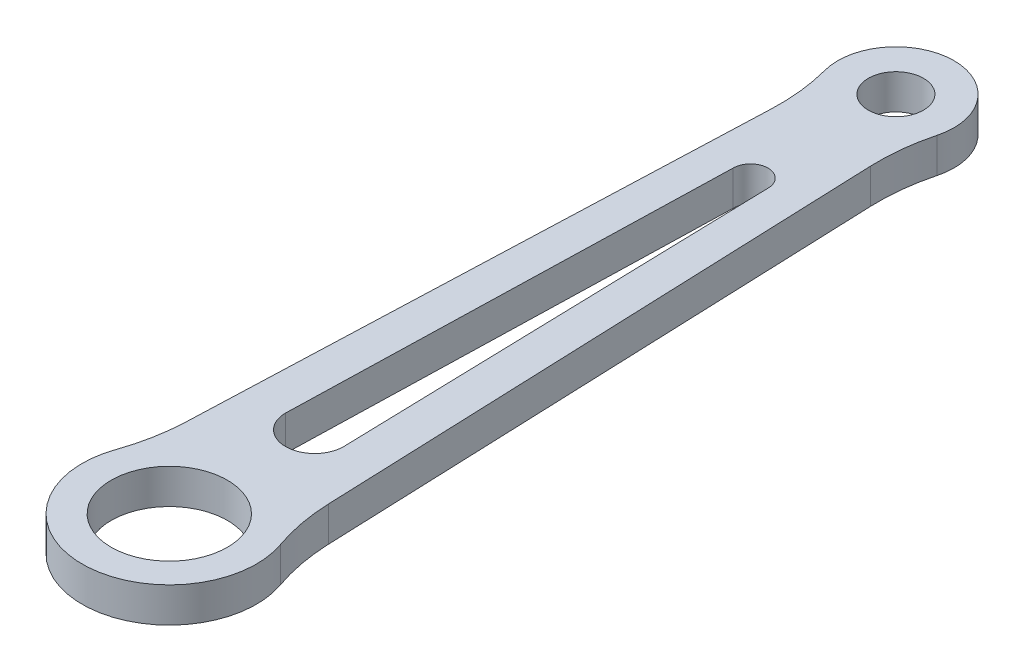
ISO-10303-21;
HEADER;
FILE_DESCRIPTION(('STEP AP214'),'2;1');
FILE_NAME('part.step','',(''),(''),'','','');
FILE_SCHEMA(('AUTOMOTIVE_DESIGN { 1 0 10303 214 1 1 1 1 }'));
ENDSEC;
DATA;
#1=APPLICATION_CONTEXT('core data for automotive mechanical design processes');
#2=APPLICATION_PROTOCOL_DEFINITION('international standard','automotive_design',2000,#1);
#3=PRODUCT_CONTEXT('',#1,'mechanical');
#4=PRODUCT('Part','Part','',(#3));
#5=PRODUCT_RELATED_PRODUCT_CATEGORY('part','',(#4));
#6=PRODUCT_DEFINITION_FORMATION('','',#4);
#7=PRODUCT_DEFINITION_CONTEXT('part definition',#1,'design');
#8=PRODUCT_DEFINITION('design','',#6,#7);
#9=PRODUCT_DEFINITION_SHAPE('','',#8);
#10=(LENGTH_UNIT() NAMED_UNIT(*) SI_UNIT(.MILLI.,.METRE.));
#11=(NAMED_UNIT(*) PLANE_ANGLE_UNIT() SI_UNIT($,.RADIAN.));
#12=(NAMED_UNIT(*) SI_UNIT($,.STERADIAN.) SOLID_ANGLE_UNIT());
#13=UNCERTAINTY_MEASURE_WITH_UNIT(LENGTH_MEASURE(1.E-05),#10,'distance_accuracy_value','');
#14=(GEOMETRIC_REPRESENTATION_CONTEXT(3) GLOBAL_UNCERTAINTY_ASSIGNED_CONTEXT((#13)) GLOBAL_UNIT_ASSIGNED_CONTEXT((#10,
#11,#12)) REPRESENTATION_CONTEXT('',''));
#15=CARTESIAN_POINT('',(0.,0.,0.));
#16=DIRECTION('',(0.,0.,1.));
#17=DIRECTION('',(1.,0.,0.));
#18=AXIS2_PLACEMENT_3D('',#15,#16,#17);
#19=CARTESIAN_POINT('',(0.,12.,0.));
#20=DIRECTION('',(0.,1.,0.));
#21=DIRECTION('',(0.,0.,1.));
#22=AXIS2_PLACEMENT_3D('',#19,#20,#21);
#23=PLANE('',#22);
#24=DIRECTION('',(0.0382406015651433,0.,-0.999268560694239));
#25=VECTOR('',#24,1.);
#26=CARTESIAN_POINT('',(-25.597124885427,12.,-0.979565946993043));
#27=LINE('',#26,#25);
#28=CARTESIAN_POINT('',(-24.4772515869623,12.,-30.2430747129415));
#29=VERTEX_POINT('',#28);
#30=CARTESIAN_POINT('',(-17.0516738536364,12.,-224.281506908195));
#31=VERTEX_POINT('',#30);
#32=EDGE_CURVE('E92',#29,#31,#27,.T.);
#33=ORIENTED_EDGE('',*,*,#32,.F.);
#34=CARTESIAN_POINT('',(-94.4260508355591,12.,-32.9199168225015));
#35=DIRECTION('',(0.,1.,0.));
#36=DIRECTION('',(0.,0.,1.));
#37=AXIS2_PLACEMENT_3D('',#34,#35,#36);
#38=CIRCLE('',#37,70.);
#39=CARTESIAN_POINT('',(-28.3278152506677,12.,-9.87597504675045));
#40=VERTEX_POINT('',#39);
#41=EDGE_CURVE('E198',#40,#29,#38,.T.);
#42=ORIENTED_EDGE('',*,*,#41,.F.);
#43=CARTESIAN_POINT('',(0.,12.,0.));
#44=DIRECTION('',(0.,1.,0.));
#45=DIRECTION('',(0.,0.,1.));
#46=AXIS2_PLACEMENT_3D('',#43,#44,#45);
#47=CIRCLE('',#46,30.);
#48=CARTESIAN_POINT('',(28.3278152506677,12.,-9.87597504675047));
#49=VERTEX_POINT('',#48);
#50=EDGE_CURVE('E212',#40,#49,#47,.T.);
#51=ORIENTED_EDGE('',*,*,#50,.T.);
#52=CARTESIAN_POINT('',(94.4260508355591,12.,-32.9199168225015));
#53=DIRECTION('',(0.,1.,0.));
#54=DIRECTION('',(0.,0.,1.));
#55=AXIS2_PLACEMENT_3D('',#52,#53,#54);
#56=CIRCLE('',#55,70.);
#57=CARTESIAN_POINT('',(24.4772515869623,12.,-30.2430747129415));
#58=VERTEX_POINT('',#57);
#59=EDGE_CURVE('E215',#49,#58,#56,.F.);
#60=ORIENTED_EDGE('',*,*,#59,.T.);
#61=DIRECTION('',(-0.0382406015651433,0.,-0.999268560694239));
#62=VECTOR('',#61,1.);
#63=CARTESIAN_POINT('',(25.597124885427,12.,-0.979565946993043));
#64=LINE('',#63,#62);
#65=CARTESIAN_POINT('',(17.0516738536364,12.,-224.281506908195));
#66=VERTEX_POINT('',#65);
#67=EDGE_CURVE('E218',#58,#66,#64,.T.);
#68=ORIENTED_EDGE('',*,*,#67,.T.);
#69=CARTESIAN_POINT('',(87.0004731022332,12.,-226.958349017755));
#70=DIRECTION('',(0.,1.,0.));
#71=DIRECTION('',(0.,0.,1.));
#72=AXIS2_PLACEMENT_3D('',#69,#70,#71);
#73=CIRCLE('',#72,70.);
#74=CARTESIAN_POINT('',(19.3334384671629,12.,-244.879633115057));
#75=VERTEX_POINT('',#74);
#76=EDGE_CURVE('E221',#66,#75,#73,.F.);
#77=ORIENTED_EDGE('',*,*,#76,.T.);
#78=CARTESIAN_POINT('',(0.,12.,-250.));
#79=DIRECTION('',(0.,1.,0.));
#80=DIRECTION('',(0.,0.,1.));
#81=AXIS2_PLACEMENT_3D('',#78,#79,#80);
#82=CIRCLE('',#81,20.);
#83=CARTESIAN_POINT('',(-19.3334384671629,12.,-244.879633115057));
#84=VERTEX_POINT('',#83);
#85=EDGE_CURVE('E224',#75,#84,#82,.T.);
#86=ORIENTED_EDGE('',*,*,#85,.T.);
#87=CARTESIAN_POINT('',(-87.0004731022332,12.,-226.958349017755));
#88=DIRECTION('',(0.,1.,0.));
#89=DIRECTION('',(0.,0.,1.));
#90=AXIS2_PLACEMENT_3D('',#87,#88,#89);
#91=CIRCLE('',#90,70.);
#92=EDGE_CURVE('E227',#31,#84,#91,.T.);
#93=ORIENTED_EDGE('',*,*,#92,.F.);
#94=EDGE_LOOP('',(#33,#42,#51,#60,#68,#77,#86,#93));
#95=FACE_BOUND('',#94,.T.);
#96=CARTESIAN_POINT('',(0.,12.,-50.));
#97=DIRECTION('',(0.,1.,0.));
#98=DIRECTION('',(0.,0.,1.));
#99=AXIS2_PLACEMENT_3D('',#96,#97,#98);
#100=CIRCLE('',#99,9.99999999999994);
#101=CARTESIAN_POINT('',(-9.99999999999994,12.,-50.));
#102=VERTEX_POINT('',#101);
#103=CARTESIAN_POINT('',(9.99999999999994,12.,-50.));
#104=VERTEX_POINT('',#103);
#105=EDGE_CURVE('E100',#102,#104,#100,.T.);
#106=ORIENTED_EDGE('',*,*,#105,.F.);
#107=DIRECTION('',(-0.0266571902389802,0.,0.999644633961771));
#108=VECTOR('',#107,1.);
#109=CARTESIAN_POINT('',(-11.3252798010303,12.,-0.302007461360805));
#110=LINE('',#109,#108);
#111=CARTESIAN_POINT('',(-5.99999999999999,12.,-200.));
#112=VERTEX_POINT('',#111);
#113=EDGE_CURVE('E176',#112,#102,#110,.T.);
#114=ORIENTED_EDGE('',*,*,#113,.F.);
#115=CARTESIAN_POINT('',(0.,12.,-200.));
#116=DIRECTION('',(0.,1.,0.));
#117=DIRECTION('',(0.,0.,1.));
#118=AXIS2_PLACEMENT_3D('',#115,#116,#117);
#119=CIRCLE('',#118,5.99999999999999);
#120=CARTESIAN_POINT('',(5.99999999999999,12.,-200.));
#121=VERTEX_POINT('',#120);
#122=EDGE_CURVE('E182',#121,#112,#119,.T.);
#123=ORIENTED_EDGE('',*,*,#122,.F.);
#124=DIRECTION('',(0.0266571902389802,0.,0.999644633961771));
#125=VECTOR('',#124,1.);
#126=CARTESIAN_POINT('',(11.3252798010303,12.,-0.302007461360805));
#127=LINE('',#126,#125);
#128=EDGE_CURVE('E188',#121,#104,#127,.T.);
#129=ORIENTED_EDGE('',*,*,#128,.T.);
#130=EDGE_LOOP('',(#106,#114,#123,#129));
#131=FACE_BOUND('',#130,.T.);
#132=CARTESIAN_POINT('',(0.,12.,0.));
#133=DIRECTION('',(0.,1.,0.));
#134=DIRECTION('',(0.,0.,1.));
#135=AXIS2_PLACEMENT_3D('',#132,#133,#134);
#136=CIRCLE('',#135,19.9999971966483);
#137=CARTESIAN_POINT('',(0.,12.,19.9999971966483));
#138=VERTEX_POINT('',#137);
#139=EDGE_CURVE('E231',#138,#138,#136,.T.);
#140=ORIENTED_EDGE('',*,*,#139,.F.);
#141=EDGE_LOOP('',(#140));
#142=FACE_BOUND('',#141,.T.);
#143=CARTESIAN_POINT('',(0.,12.,-250.));
#144=DIRECTION('',(0.,1.,0.));
#145=DIRECTION('',(0.,0.,1.));
#146=AXIS2_PLACEMENT_3D('',#143,#144,#145);
#147=CIRCLE('',#146,9.5);
#148=CARTESIAN_POINT('',(0.,12.,-240.5));
#149=VERTEX_POINT('',#148);
#150=EDGE_CURVE('E235',#149,#149,#147,.T.);
#151=ORIENTED_EDGE('',*,*,#150,.F.);
#152=EDGE_LOOP('',(#151));
#153=FACE_BOUND('',#152,.T.);
#154=ADVANCED_FACE('F77',(#95,#131,#142,#153),#23,.T.);
#155=CARTESIAN_POINT('',(0.,0.,0.));
#156=DIRECTION('',(0.,1.,0.));
#157=DIRECTION('',(0.,0.,1.));
#158=AXIS2_PLACEMENT_3D('',#155,#156,#157);
#159=PLANE('',#158);
#160=CARTESIAN_POINT('',(-94.4260508355591,0.,-32.9199168225015));
#161=DIRECTION('',(0.,1.,0.));
#162=DIRECTION('',(0.,0.,1.));
#163=AXIS2_PLACEMENT_3D('',#160,#161,#162);
#164=CIRCLE('',#163,70.);
#165=CARTESIAN_POINT('',(-28.3278152506677,0.,-9.87597504675045));
#166=VERTEX_POINT('',#165);
#167=CARTESIAN_POINT('',(-24.4772515869623,0.,-30.2430747129415));
#168=VERTEX_POINT('',#167);
#169=EDGE_CURVE('E85',#166,#168,#164,.T.);
#170=ORIENTED_EDGE('',*,*,#169,.T.);
#171=DIRECTION('',(0.0382406015651433,0.,-0.999268560694239));
#172=VECTOR('',#171,1.);
#173=CARTESIAN_POINT('',(-25.597124885427,0.,-0.979565946993044));
#174=LINE('',#173,#172);
#175=CARTESIAN_POINT('',(-17.0516738536364,0.,-224.281506908195));
#176=VERTEX_POINT('',#175);
#177=EDGE_CURVE('E12',#168,#176,#174,.T.);
#178=ORIENTED_EDGE('',*,*,#177,.T.);
#179=CARTESIAN_POINT('',(-87.0004731022332,0.,-226.958349017755));
#180=DIRECTION('',(0.,1.,0.));
#181=DIRECTION('',(0.,0.,1.));
#182=AXIS2_PLACEMENT_3D('',#179,#180,#181);
#183=CIRCLE('',#182,70.);
#184=CARTESIAN_POINT('',(-19.3334384671629,0.,-244.879633115057));
#185=VERTEX_POINT('',#184);
#186=EDGE_CURVE('E251',#176,#185,#183,.T.);
#187=ORIENTED_EDGE('',*,*,#186,.T.);
#188=CARTESIAN_POINT('',(0.,0.,-250.));
#189=DIRECTION('',(0.,1.,0.));
#190=DIRECTION('',(0.,0.,1.));
#191=AXIS2_PLACEMENT_3D('',#188,#189,#190);
#192=CIRCLE('',#191,20.);
#193=CARTESIAN_POINT('',(19.3334384671629,0.,-244.879633115057));
#194=VERTEX_POINT('',#193);
#195=EDGE_CURVE('E254',#194,#185,#192,.T.);
#196=ORIENTED_EDGE('',*,*,#195,.F.);
#197=CARTESIAN_POINT('',(87.0004731022332,0.,-226.958349017755));
#198=DIRECTION('',(0.,1.,0.));
#199=DIRECTION('',(0.,0.,1.));
#200=AXIS2_PLACEMENT_3D('',#197,#198,#199);
#201=CIRCLE('',#200,70.);
#202=CARTESIAN_POINT('',(17.0516738536364,0.,-224.281506908195));
#203=VERTEX_POINT('',#202);
#204=EDGE_CURVE('E257',#203,#194,#201,.F.);
#205=ORIENTED_EDGE('',*,*,#204,.F.);
#206=DIRECTION('',(-0.0382406015651433,0.,-0.999268560694239));
#207=VECTOR('',#206,1.);
#208=CARTESIAN_POINT('',(25.597124885427,0.,-0.979565946993044));
#209=LINE('',#208,#207);
#210=CARTESIAN_POINT('',(24.4772515869623,0.,-30.2430747129415));
#211=VERTEX_POINT('',#210);
#212=EDGE_CURVE('E259',#211,#203,#209,.T.);
#213=ORIENTED_EDGE('',*,*,#212,.F.);
#214=CARTESIAN_POINT('',(94.4260508355591,0.,-32.9199168225015));
#215=DIRECTION('',(0.,1.,0.));
#216=DIRECTION('',(0.,0.,1.));
#217=AXIS2_PLACEMENT_3D('',#214,#215,#216);
#218=CIRCLE('',#217,70.);
#219=CARTESIAN_POINT('',(28.3278152506677,0.,-9.87597504675047));
#220=VERTEX_POINT('',#219);
#221=EDGE_CURVE('E261',#220,#211,#218,.F.);
#222=ORIENTED_EDGE('',*,*,#221,.F.);
#223=CARTESIAN_POINT('',(0.,0.,0.));
#224=DIRECTION('',(0.,1.,0.));
#225=DIRECTION('',(0.,0.,1.));
#226=AXIS2_PLACEMENT_3D('',#223,#224,#225);
#227=CIRCLE('',#226,30.);
#228=EDGE_CURVE('E263',#166,#220,#227,.T.);
#229=ORIENTED_EDGE('',*,*,#228,.F.);
#230=EDGE_LOOP('',(#170,#178,#187,#196,#205,#213,#222,#229));
#231=FACE_BOUND('',#230,.T.);
#232=DIRECTION('',(-0.0266571902389802,0.,0.999644633961771));
#233=VECTOR('',#232,1.);
#234=CARTESIAN_POINT('',(-11.3252798010303,0.,-0.302007461360805));
#235=LINE('',#234,#233);
#236=CARTESIAN_POINT('',(-5.99999999999999,0.,-200.));
#237=VERTEX_POINT('',#236);
#238=CARTESIAN_POINT('',(-9.99999999999994,0.,-50.));
#239=VERTEX_POINT('',#238);
#240=EDGE_CURVE('E248',#237,#239,#235,.T.);
#241=ORIENTED_EDGE('',*,*,#240,.T.);
#242=CARTESIAN_POINT('',(0.,0.,-50.));
#243=DIRECTION('',(0.,1.,0.));
#244=DIRECTION('',(0.,0.,1.));
#245=AXIS2_PLACEMENT_3D('',#242,#243,#244);
#246=CIRCLE('',#245,9.99999999999994);
#247=CARTESIAN_POINT('',(9.99999999999994,0.,-50.));
#248=VERTEX_POINT('',#247);
#249=EDGE_CURVE('E170',#239,#248,#246,.T.);
#250=ORIENTED_EDGE('',*,*,#249,.T.);
#251=DIRECTION('',(0.0266571902389802,0.,0.999644633961771));
#252=VECTOR('',#251,1.);
#253=CARTESIAN_POINT('',(11.3252798010303,0.,-0.302007461360805));
#254=LINE('',#253,#252);
#255=CARTESIAN_POINT('',(5.99999999999999,0.,-200.));
#256=VERTEX_POINT('',#255);
#257=EDGE_CURVE('E238',#256,#248,#254,.T.);
#258=ORIENTED_EDGE('',*,*,#257,.F.);
#259=CARTESIAN_POINT('',(0.,0.,-200.));
#260=DIRECTION('',(0.,1.,0.));
#261=DIRECTION('',(0.,0.,1.));
#262=AXIS2_PLACEMENT_3D('',#259,#260,#261);
#263=CIRCLE('',#262,5.99999999999999);
#264=EDGE_CURVE('E245',#256,#237,#263,.T.);
#265=ORIENTED_EDGE('',*,*,#264,.T.);
#266=EDGE_LOOP('',(#241,#250,#258,#265));
#267=FACE_BOUND('',#266,.T.);
#268=CARTESIAN_POINT('',(0.,0.,0.));
#269=DIRECTION('',(0.,1.,0.));
#270=DIRECTION('',(0.,0.,1.));
#271=AXIS2_PLACEMENT_3D('',#268,#269,#270);
#272=CIRCLE('',#271,19.9999971966483);
#273=CARTESIAN_POINT('',(0.,0.,19.9999971966483));
#274=VERTEX_POINT('',#273);
#275=EDGE_CURVE('E234',#274,#274,#272,.T.);
#276=ORIENTED_EDGE('',*,*,#275,.T.);
#277=EDGE_LOOP('',(#276));
#278=FACE_BOUND('',#277,.T.);
#279=CARTESIAN_POINT('',(0.,0.,-250.));
#280=DIRECTION('',(0.,1.,0.));
#281=DIRECTION('',(0.,0.,1.));
#282=AXIS2_PLACEMENT_3D('',#279,#280,#281);
#283=CIRCLE('',#282,9.5);
#284=CARTESIAN_POINT('',(0.,0.,-240.5));
#285=VERTEX_POINT('',#284);
#286=EDGE_CURVE('E239',#285,#285,#283,.T.);
#287=ORIENTED_EDGE('',*,*,#286,.T.);
#288=EDGE_LOOP('',(#287));
#289=FACE_BOUND('',#288,.T.);
#290=ADVANCED_FACE('F79',(#231,#267,#278,#289),#159,.F.);
#291=CARTESIAN_POINT('',(0.,12.,-250.));
#292=DIRECTION('',(0.,-1.,0.));
#293=DIRECTION('',(0.,0.,-1.));
#294=AXIS2_PLACEMENT_3D('',#291,#292,#293);
#295=CYLINDRICAL_SURFACE('',#294,9.5);
#296=ORIENTED_EDGE('',*,*,#150,.T.);
#297=EDGE_LOOP('',(#296));
#298=FACE_BOUND('',#297,.T.);
#299=ORIENTED_EDGE('',*,*,#286,.F.);
#300=EDGE_LOOP('',(#299));
#301=FACE_BOUND('',#300,.T.);
#302=ADVANCED_FACE('F302',(#298,#301),#295,.F.);
#303=CARTESIAN_POINT('',(0.,-13.,0.));
#304=DIRECTION('',(0.,1.,0.));
#305=DIRECTION('',(0.,0.,1.));
#306=AXIS2_PLACEMENT_3D('',#303,#304,#305);
#307=CYLINDRICAL_SURFACE('',#306,19.9999971966483);
#308=ORIENTED_EDGE('',*,*,#139,.T.);
#309=EDGE_LOOP('',(#308));
#310=FACE_BOUND('',#309,.T.);
#311=ORIENTED_EDGE('',*,*,#275,.F.);
#312=EDGE_LOOP('',(#311));
#313=FACE_BOUND('',#312,.T.);
#314=ADVANCED_FACE('F306',(#310,#313),#307,.F.);
#315=CARTESIAN_POINT('',(0.,-13.,-50.));
#316=DIRECTION('',(0.,1.,0.));
#317=DIRECTION('',(0.,0.,1.));
#318=AXIS2_PLACEMENT_3D('',#315,#316,#317);
#319=CYLINDRICAL_SURFACE('',#318,9.99999999999994);
#320=DIRECTION('',(0.,1.,0.));
#321=VECTOR('',#320,1.);
#322=CARTESIAN_POINT('',(-9.99999999999994,-13.,-50.));
#323=LINE('',#322,#321);
#324=EDGE_CURVE('E166',#239,#102,#323,.T.);
#325=ORIENTED_EDGE('',*,*,#324,.T.);
#326=ORIENTED_EDGE('',*,*,#105,.T.);
#327=DIRECTION('',(0.,1.,0.));
#328=VECTOR('',#327,1.);
#329=CARTESIAN_POINT('',(9.99999999999994,-13.,-50.));
#330=LINE('',#329,#328);
#331=EDGE_CURVE('E183',#248,#104,#330,.T.);
#332=ORIENTED_EDGE('',*,*,#331,.F.);
#333=ORIENTED_EDGE('',*,*,#249,.F.);
#334=EDGE_LOOP('',(#325,#326,#332,#333));
#335=FACE_BOUND('',#334,.T.);
#336=ADVANCED_FACE('F168',(#335),#319,.F.);
#337=CARTESIAN_POINT('',(-11.3252798010303,-13.,-0.302007461360805));
#338=DIRECTION('',(-0.999644633961771,0.,-0.0266571902389802));
#339=DIRECTION('',(-0.0266571902389802,0.,0.999644633961771));
#340=AXIS2_PLACEMENT_3D('',#337,#338,#339);
#341=PLANE('',#340);
#342=DIRECTION('',(0.,1.,0.));
#343=VECTOR('',#342,1.);
#344=CARTESIAN_POINT('',(-5.99999999999999,-13.,-200.));
#345=LINE('',#344,#343);
#346=EDGE_CURVE('E173',#237,#112,#345,.T.);
#347=ORIENTED_EDGE('',*,*,#346,.T.);
#348=ORIENTED_EDGE('',*,*,#113,.T.);
#349=ORIENTED_EDGE('',*,*,#324,.F.);
#350=ORIENTED_EDGE('',*,*,#240,.F.);
#351=EDGE_LOOP('',(#347,#348,#349,#350));
#352=FACE_BOUND('',#351,.T.);
#353=ADVANCED_FACE('F177',(#352),#341,.F.);
#354=CARTESIAN_POINT('',(0.,-13.,-200.));
#355=DIRECTION('',(0.,1.,0.));
#356=DIRECTION('',(0.,0.,1.));
#357=AXIS2_PLACEMENT_3D('',#354,#355,#356);
#358=CYLINDRICAL_SURFACE('',#357,5.99999999999999);
#359=DIRECTION('',(0.,1.,0.));
#360=VECTOR('',#359,1.);
#361=CARTESIAN_POINT('',(5.99999999999999,-13.,-200.));
#362=LINE('',#361,#360);
#363=EDGE_CURVE('E436',#256,#121,#362,.T.);
#364=ORIENTED_EDGE('',*,*,#363,.T.);
#365=ORIENTED_EDGE('',*,*,#122,.T.);
#366=ORIENTED_EDGE('',*,*,#346,.F.);
#367=ORIENTED_EDGE('',*,*,#264,.F.);
#368=EDGE_LOOP('',(#364,#365,#366,#367));
#369=FACE_BOUND('',#368,.T.);
#370=ADVANCED_FACE('F293',(#369),#358,.F.);
#371=CARTESIAN_POINT('',(11.3252798010303,-13.,-0.302007461360805));
#372=DIRECTION('',(-0.999644633961771,0.,0.0266571902389802));
#373=DIRECTION('',(0.0266571902389802,0.,0.999644633961771));
#374=AXIS2_PLACEMENT_3D('',#371,#372,#373);
#375=PLANE('',#374);
#376=ORIENTED_EDGE('',*,*,#257,.T.);
#377=ORIENTED_EDGE('',*,*,#331,.T.);
#378=ORIENTED_EDGE('',*,*,#128,.F.);
#379=ORIENTED_EDGE('',*,*,#363,.F.);
#380=EDGE_LOOP('',(#376,#377,#378,#379));
#381=FACE_BOUND('',#380,.T.);
#382=ADVANCED_FACE('F286',(#381),#375,.T.);
#383=CARTESIAN_POINT('',(-25.597124885427,-13.,-0.979565946993043));
#384=DIRECTION('',(0.999268560694239,0.,0.0382406015651433));
#385=DIRECTION('',(0.0382406015651433,0.,-0.999268560694239));
#386=AXIS2_PLACEMENT_3D('',#383,#384,#385);
#387=PLANE('',#386);
#388=DIRECTION('',(0.,1.,0.));
#389=VECTOR('',#388,1.);
#390=CARTESIAN_POINT('',(-24.4772515869623,-13.,-30.2430747129415));
#391=LINE('',#390,#389);
#392=EDGE_CURVE('E189',#168,#29,#391,.T.);
#393=ORIENTED_EDGE('',*,*,#392,.T.);
#394=ORIENTED_EDGE('',*,*,#32,.T.);
#395=DIRECTION('',(0.,1.,0.));
#396=VECTOR('',#395,1.);
#397=CARTESIAN_POINT('',(-17.0516738536364,-13.,-224.281506908195));
#398=LINE('',#397,#396);
#399=EDGE_CURVE('E196',#176,#31,#398,.T.);
#400=ORIENTED_EDGE('',*,*,#399,.F.);
#401=ORIENTED_EDGE('',*,*,#177,.F.);
#402=EDGE_LOOP('',(#393,#394,#400,#401));
#403=FACE_BOUND('',#402,.T.);
#404=ADVANCED_FACE('F284',(#403),#387,.F.);
#405=CARTESIAN_POINT('',(-94.4260508355591,-13.,-32.9199168225015));
#406=DIRECTION('',(0.,1.,0.));
#407=DIRECTION('',(0.,0.,1.));
#408=AXIS2_PLACEMENT_3D('',#405,#406,#407);
#409=CYLINDRICAL_SURFACE('',#408,70.);
#410=DIRECTION('',(0.,1.,0.));
#411=VECTOR('',#410,1.);
#412=CARTESIAN_POINT('',(-28.3278152506677,-13.,-9.87597504675045));
#413=LINE('',#412,#411);
#414=EDGE_CURVE('E191',#166,#40,#413,.T.);
#415=ORIENTED_EDGE('',*,*,#414,.T.);
#416=ORIENTED_EDGE('',*,*,#41,.T.);
#417=ORIENTED_EDGE('',*,*,#392,.F.);
#418=ORIENTED_EDGE('',*,*,#169,.F.);
#419=EDGE_LOOP('',(#415,#416,#417,#418));
#420=FACE_BOUND('',#419,.T.);
#421=ADVANCED_FACE('F272',(#420),#409,.F.);
#422=CARTESIAN_POINT('',(0.,-13.,0.));
#423=DIRECTION('',(0.,1.,0.));
#424=DIRECTION('',(0.,0.,1.));
#425=AXIS2_PLACEMENT_3D('',#422,#423,#424);
#426=CYLINDRICAL_SURFACE('',#425,30.);
#427=ORIENTED_EDGE('',*,*,#228,.T.);
#428=DIRECTION('',(0.,1.,0.));
#429=VECTOR('',#428,1.);
#430=CARTESIAN_POINT('',(28.3278152506677,-13.,-9.87597504675047));
#431=LINE('',#430,#429);
#432=EDGE_CURVE('E207',#220,#49,#431,.T.);
#433=ORIENTED_EDGE('',*,*,#432,.T.);
#434=ORIENTED_EDGE('',*,*,#50,.F.);
#435=ORIENTED_EDGE('',*,*,#414,.F.);
#436=EDGE_LOOP('',(#427,#433,#434,#435));
#437=FACE_BOUND('',#436,.T.);
#438=ADVANCED_FACE('F275',(#437),#426,.T.);
#439=CARTESIAN_POINT('',(94.4260508355591,-13.,-32.9199168225015));
#440=DIRECTION('',(0.,1.,0.));
#441=DIRECTION('',(0.,0.,1.));
#442=AXIS2_PLACEMENT_3D('',#439,#440,#441);
#443=CYLINDRICAL_SURFACE('',#442,70.);
#444=ORIENTED_EDGE('',*,*,#221,.T.);
#445=DIRECTION('',(0.,1.,0.));
#446=VECTOR('',#445,1.);
#447=CARTESIAN_POINT('',(24.4772515869623,-13.,-30.2430747129415));
#448=LINE('',#447,#446);
#449=EDGE_CURVE('E205',#211,#58,#448,.T.);
#450=ORIENTED_EDGE('',*,*,#449,.T.);
#451=ORIENTED_EDGE('',*,*,#59,.F.);
#452=ORIENTED_EDGE('',*,*,#432,.F.);
#453=EDGE_LOOP('',(#444,#450,#451,#452));
#454=FACE_BOUND('',#453,.T.);
#455=ADVANCED_FACE('F313',(#454),#443,.F.);
#456=CARTESIAN_POINT('',(25.597124885427,-13.,-0.979565946993043));
#457=DIRECTION('',(0.999268560694239,0.,-0.0382406015651433));
#458=DIRECTION('',(-0.0382406015651433,0.,-0.999268560694239));
#459=AXIS2_PLACEMENT_3D('',#456,#457,#458);
#460=PLANE('',#459);
#461=ORIENTED_EDGE('',*,*,#212,.T.);
#462=DIRECTION('',(0.,1.,0.));
#463=VECTOR('',#462,1.);
#464=CARTESIAN_POINT('',(17.0516738536364,-13.,-224.281506908195));
#465=LINE('',#464,#463);
#466=EDGE_CURVE('E203',#203,#66,#465,.T.);
#467=ORIENTED_EDGE('',*,*,#466,.T.);
#468=ORIENTED_EDGE('',*,*,#67,.F.);
#469=ORIENTED_EDGE('',*,*,#449,.F.);
#470=EDGE_LOOP('',(#461,#467,#468,#469));
#471=FACE_BOUND('',#470,.T.);
#472=ADVANCED_FACE('F316',(#471),#460,.T.);
#473=CARTESIAN_POINT('',(87.0004731022332,-13.,-226.958349017755));
#474=DIRECTION('',(0.,1.,0.));
#475=DIRECTION('',(0.,0.,1.));
#476=AXIS2_PLACEMENT_3D('',#473,#474,#475);
#477=CYLINDRICAL_SURFACE('',#476,70.);
#478=ORIENTED_EDGE('',*,*,#204,.T.);
#479=DIRECTION('',(0.,1.,0.));
#480=VECTOR('',#479,1.);
#481=CARTESIAN_POINT('',(19.3334384671629,-13.,-244.879633115057));
#482=LINE('',#481,#480);
#483=EDGE_CURVE('E201',#194,#75,#482,.T.);
#484=ORIENTED_EDGE('',*,*,#483,.T.);
#485=ORIENTED_EDGE('',*,*,#76,.F.);
#486=ORIENTED_EDGE('',*,*,#466,.F.);
#487=EDGE_LOOP('',(#478,#484,#485,#486));
#488=FACE_BOUND('',#487,.T.);
#489=ADVANCED_FACE('F320',(#488),#477,.F.);
#490=CARTESIAN_POINT('',(0.,-13.,-250.));
#491=DIRECTION('',(0.,1.,0.));
#492=DIRECTION('',(0.,0.,1.));
#493=AXIS2_PLACEMENT_3D('',#490,#491,#492);
#494=CYLINDRICAL_SURFACE('',#493,20.);
#495=ORIENTED_EDGE('',*,*,#195,.T.);
#496=DIRECTION('',(0.,1.,0.));
#497=VECTOR('',#496,1.);
#498=CARTESIAN_POINT('',(-19.3334384671629,-13.,-244.879633115057));
#499=LINE('',#498,#497);
#500=EDGE_CURVE('E199',#185,#84,#499,.T.);
#501=ORIENTED_EDGE('',*,*,#500,.T.);
#502=ORIENTED_EDGE('',*,*,#85,.F.);
#503=ORIENTED_EDGE('',*,*,#483,.F.);
#504=EDGE_LOOP('',(#495,#501,#502,#503));
#505=FACE_BOUND('',#504,.T.);
#506=ADVANCED_FACE('F324',(#505),#494,.T.);
#507=CARTESIAN_POINT('',(-87.0004731022332,-13.,-226.958349017755));
#508=DIRECTION('',(0.,1.,0.));
#509=DIRECTION('',(0.,0.,1.));
#510=AXIS2_PLACEMENT_3D('',#507,#508,#509);
#511=CYLINDRICAL_SURFACE('',#510,70.);
#512=ORIENTED_EDGE('',*,*,#399,.T.);
#513=ORIENTED_EDGE('',*,*,#92,.T.);
#514=ORIENTED_EDGE('',*,*,#500,.F.);
#515=ORIENTED_EDGE('',*,*,#186,.F.);
#516=EDGE_LOOP('',(#512,#513,#514,#515));
#517=FACE_BOUND('',#516,.T.);
#518=ADVANCED_FACE('F283',(#517),#511,.F.);
#519=CLOSED_SHELL('',(#154,#290,#302,#314,#336,#353,#370,#382,#404,#421,#438,#455,#472,#489,
#506,#518));
#520=MANIFOLD_SOLID_BREP('B2',#519);
#521=ADVANCED_BREP_SHAPE_REPRESENTATION('',(#18,#520),#14);
#522=SHAPE_DEFINITION_REPRESENTATION(#9,#521);
ENDSEC;
END-ISO-10303-21;
